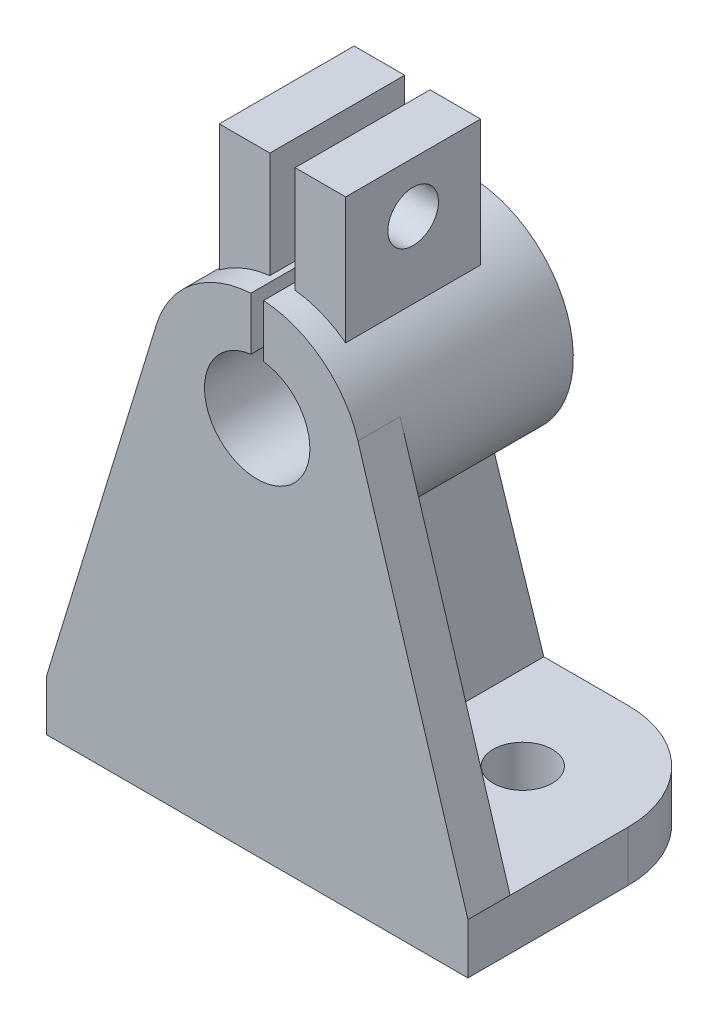
ISO-10303-21;
HEADER;
FILE_DESCRIPTION(('STEP AP214'),'2;1');
FILE_NAME('part.step','',(''),(''),'','','');
FILE_SCHEMA(('AUTOMOTIVE_DESIGN { 1 0 10303 214 1 1 1 1 }'));
ENDSEC;
DATA;
#1=APPLICATION_CONTEXT('core data for automotive mechanical design processes');
#2=APPLICATION_PROTOCOL_DEFINITION('international standard','automotive_design',2000,#1);
#3=PRODUCT_CONTEXT('',#1,'mechanical');
#4=PRODUCT('Part','Part','',(#3));
#5=PRODUCT_RELATED_PRODUCT_CATEGORY('part','',(#4));
#6=PRODUCT_DEFINITION_FORMATION('','',#4);
#7=PRODUCT_DEFINITION_CONTEXT('part definition',#1,'design');
#8=PRODUCT_DEFINITION('design','',#6,#7);
#9=PRODUCT_DEFINITION_SHAPE('','',#8);
#10=(LENGTH_UNIT() NAMED_UNIT(*) SI_UNIT(.MILLI.,.METRE.));
#11=(NAMED_UNIT(*) PLANE_ANGLE_UNIT() SI_UNIT($,.RADIAN.));
#12=(NAMED_UNIT(*) SI_UNIT($,.STERADIAN.) SOLID_ANGLE_UNIT());
#13=UNCERTAINTY_MEASURE_WITH_UNIT(LENGTH_MEASURE(1.E-05),#10,'distance_accuracy_value','');
#14=(GEOMETRIC_REPRESENTATION_CONTEXT(3) GLOBAL_UNCERTAINTY_ASSIGNED_CONTEXT((#13)) GLOBAL_UNIT_ASSIGNED_CONTEXT((#10,
#11,#12)) REPRESENTATION_CONTEXT('',''));
#15=CARTESIAN_POINT('',(0.,0.,0.));
#16=DIRECTION('',(0.,0.,1.));
#17=DIRECTION('',(1.,0.,0.));
#18=AXIS2_PLACEMENT_3D('',#15,#16,#17);
#19=CARTESIAN_POINT('',(0.,90.,-50.));
#20=DIRECTION('',(0.,0.,1.));
#21=DIRECTION('',(1.,0.,0.));
#22=AXIS2_PLACEMENT_3D('',#19,#20,#21);
#23=PLANE('',#22);
#24=CARTESIAN_POINT('',(0.,90.,-50.));
#25=DIRECTION('',(0.,0.,-1.));
#26=DIRECTION('',(-1.,0.,0.));
#27=AXIS2_PLACEMENT_3D('',#24,#25,#26);
#28=CIRCLE('',#27,12.5);
#29=CARTESIAN_POINT('',(1.5,102.409673645991,-50.));
#30=VERTEX_POINT('',#29);
#31=CARTESIAN_POINT('',(-1.5,102.409673645991,-50.));
#32=VERTEX_POINT('',#31);
#33=EDGE_CURVE('E217',#30,#32,#28,.T.);
#34=ORIENTED_EDGE('',*,*,#33,.F.);
#35=DIRECTION('',(0.,1.,0.));
#36=VECTOR('',#35,1.);
#37=CARTESIAN_POINT('',(1.5,90.,-50.));
#38=LINE('',#37,#36);
#39=CARTESIAN_POINT('',(1.5,114.954959426936,-50.));
#40=VERTEX_POINT('',#39);
#41=EDGE_CURVE('E230',#30,#40,#38,.T.);
#42=ORIENTED_EDGE('',*,*,#41,.T.);
#43=CARTESIAN_POINT('',(0.,90.,-50.));
#44=DIRECTION('',(0.,0.,1.));
#45=DIRECTION('',(1.,0.,0.));
#46=AXIS2_PLACEMENT_3D('',#43,#44,#45);
#47=CIRCLE('',#46,25.);
#48=CARTESIAN_POINT('',(0.,65.,-50.));
#49=VERTEX_POINT('',#48);
#50=EDGE_CURVE('E462',#49,#40,#47,.T.);
#51=ORIENTED_EDGE('',*,*,#50,.F.);
#52=CARTESIAN_POINT('',(-1.5,114.954959426936,-50.));
#53=VERTEX_POINT('',#52);
#54=EDGE_CURVE('E461',#53,#49,#47,.T.);
#55=ORIENTED_EDGE('',*,*,#54,.F.);
#56=DIRECTION('',(0.,1.,0.));
#57=VECTOR('',#56,1.);
#58=CARTESIAN_POINT('',(-1.50000000000001,140.,-50.));
#59=LINE('',#58,#57);
#60=EDGE_CURVE('E225',#32,#53,#59,.T.);
#61=ORIENTED_EDGE('',*,*,#60,.F.);
#62=EDGE_LOOP('',(#34,#42,#51,#55,#61));
#63=FACE_BOUND('',#62,.T.);
#64=ADVANCED_FACE('F45',(#63),#23,.F.);
#65=CARTESIAN_POINT('',(0.,90.,-10.));
#66=DIRECTION('',(0.,0.,1.));
#67=DIRECTION('',(1.,0.,0.));
#68=AXIS2_PLACEMENT_3D('',#65,#66,#67);
#69=CYLINDRICAL_SURFACE('',#68,25.);
#70=DIRECTION('',(0.,0.,1.));
#71=VECTOR('',#70,1.);
#72=CARTESIAN_POINT('',(1.5,114.954959426936,-10.));
#73=LINE('',#72,#71);
#74=CARTESIAN_POINT('',(1.5,114.954959426936,0.));
#75=VERTEX_POINT('',#74);
#76=EDGE_CURVE('E238',#75,#40,#73,.F.);
#77=ORIENTED_EDGE('',*,*,#76,.F.);
#78=CARTESIAN_POINT('',(0.,90.,0.));
#79=DIRECTION('',(0.,0.,1.));
#80=DIRECTION('',(1.,0.,0.));
#81=AXIS2_PLACEMENT_3D('',#78,#79,#80);
#82=CIRCLE('',#81,25.);
#83=CARTESIAN_POINT('',(23.9067793629531,97.3120380531751,0.));
#84=VERTEX_POINT('',#83);
#85=EDGE_CURVE('E471',#84,#75,#82,.T.);
#86=ORIENTED_EDGE('',*,*,#85,.F.);
#87=DIRECTION('',(0.,0.,1.));
#88=VECTOR('',#87,1.);
#89=CARTESIAN_POINT('',(23.9067793629531,97.3120380531751,-10.));
#90=LINE('',#89,#88);
#91=CARTESIAN_POINT('',(23.9067793629531,97.3120380531751,-10.));
#92=VERTEX_POINT('',#91);
#93=EDGE_CURVE('E494',#92,#84,#90,.T.);
#94=ORIENTED_EDGE('',*,*,#93,.F.);
#95=CARTESIAN_POINT('',(0.,90.,-10.));
#96=DIRECTION('',(0.,0.,1.));
#97=DIRECTION('',(1.,0.,0.));
#98=AXIS2_PLACEMENT_3D('',#95,#96,#97);
#99=CIRCLE('',#98,25.);
#100=CARTESIAN_POINT('',(5.,65.5051025721682,-10.));
#101=VERTEX_POINT('',#100);
#102=EDGE_CURVE('E327',#101,#92,#99,.T.);
#103=ORIENTED_EDGE('',*,*,#102,.F.);
#104=DIRECTION('',(0.,0.,1.));
#105=VECTOR('',#104,1.);
#106=CARTESIAN_POINT('',(5.,65.5051025721682,-10.));
#107=LINE('',#106,#105);
#108=CARTESIAN_POINT('',(5.,65.5051025721682,-49.8761069162606));
#109=VERTEX_POINT('',#108);
#110=EDGE_CURVE('E453',#109,#101,#107,.T.);
#111=ORIENTED_EDGE('',*,*,#110,.F.);
#112=CARTESIAN_POINT('',(0.,90.,-43.8679245283019));
#113=DIRECTION('',(0.,0.238221527797648,-0.971210844098105));
#114=DIRECTION('',(0.,0.971210844098105,0.238221527797648));
#115=AXIS2_PLACEMENT_3D('',#112,#113,#114);
#116=ELLIPSE('',#115,25.741063489891,25.);
#117=EDGE_CURVE('E434',#49,#109,#116,.F.);
#118=ORIENTED_EDGE('',*,*,#117,.F.);
#119=ORIENTED_EDGE('',*,*,#50,.T.);
#120=EDGE_LOOP('',(#77,#86,#94,#103,#111,#118,#119));
#121=FACE_BOUND('',#120,.T.);
#122=DIRECTION('',(0.,0.,1.));
#123=VECTOR('',#122,1.);
#124=CARTESIAN_POINT('',(15.,110.,-10.));
#125=LINE('',#124,#123);
#126=CARTESIAN_POINT('',(15.,110.,-6.00000000000001));
#127=VERTEX_POINT('',#126);
#128=CARTESIAN_POINT('',(15.,110.,-38.));
#129=VERTEX_POINT('',#128);
#130=EDGE_CURVE('E350',#127,#129,#125,.F.);
#131=ORIENTED_EDGE('',*,*,#130,.F.);
#132=CARTESIAN_POINT('',(0.,90.,-6.00000000000001));
#133=DIRECTION('',(0.,0.,-1.));
#134=DIRECTION('',(0.,1.,0.));
#135=AXIS2_PLACEMENT_3D('',#132,#133,#134);
#136=CIRCLE('',#135,25.);
#137=CARTESIAN_POINT('',(3.,114.819347291982,-6.));
#138=VERTEX_POINT('',#137);
#139=EDGE_CURVE('E346',#127,#138,#136,.F.);
#140=ORIENTED_EDGE('',*,*,#139,.T.);
#141=DIRECTION('',(0.,0.,1.));
#142=VECTOR('',#141,1.);
#143=CARTESIAN_POINT('',(3.,114.819347291982,-10.));
#144=LINE('',#143,#142);
#145=CARTESIAN_POINT('',(3.,114.819347291982,-38.));
#146=VERTEX_POINT('',#145);
#147=EDGE_CURVE('E338',#138,#146,#144,.F.);
#148=ORIENTED_EDGE('',*,*,#147,.T.);
#149=CARTESIAN_POINT('',(0.,90.,-38.));
#150=DIRECTION('',(0.,0.,1.));
#151=DIRECTION('',(0.,-1.,0.));
#152=AXIS2_PLACEMENT_3D('',#149,#150,#151);
#153=CIRCLE('',#152,25.);
#154=EDGE_CURVE('E342',#146,#129,#153,.F.);
#155=ORIENTED_EDGE('',*,*,#154,.T.);
#156=EDGE_LOOP('',(#131,#140,#148,#155));
#157=FACE_BOUND('',#156,.T.);
#158=ADVANCED_FACE('F520',(#121,#157),#69,.T.);
#159=CARTESIAN_POINT('',(0.,12.,0.));
#160=DIRECTION('',(0.,1.,0.));
#161=DIRECTION('',(0.,0.,1.));
#162=AXIS2_PLACEMENT_3D('',#159,#160,#161);
#163=PLANE('',#162);
#164=CARTESIAN_POINT('',(-25.,12.,-38.));
#165=DIRECTION('',(0.,1.,0.));
#166=DIRECTION('',(0.,0.,1.));
#167=AXIS2_PLACEMENT_3D('',#164,#165,#166);
#168=CIRCLE('',#167,7.00000000000001);
#169=CARTESIAN_POINT('',(-25.,12.,-31.));
#170=VERTEX_POINT('',#169);
#171=EDGE_CURVE('E906',#170,#170,#168,.T.);
#172=ORIENTED_EDGE('',*,*,#171,.F.);
#173=EDGE_LOOP('',(#172));
#174=FACE_BOUND('',#173,.T.);
#175=DIRECTION('',(-1.,0.,0.));
#176=VECTOR('',#175,1.);
#177=CARTESIAN_POINT('',(-50.,12.,-63.));
#178=LINE('',#177,#176);
#179=CARTESIAN_POINT('',(-5.,12.,-63.));
#180=VERTEX_POINT('',#179);
#181=CARTESIAN_POINT('',(-25.,12.,-63.));
#182=VERTEX_POINT('',#181);
#183=EDGE_CURVE('E286',#180,#182,#178,.T.);
#184=ORIENTED_EDGE('',*,*,#183,.T.);
#185=CARTESIAN_POINT('',(-25.,12.,-38.));
#186=DIRECTION('',(0.,1.,0.));
#187=DIRECTION('',(0.,0.,1.));
#188=AXIS2_PLACEMENT_3D('',#185,#186,#187);
#189=CIRCLE('',#188,25.);
#190=CARTESIAN_POINT('',(-50.,12.,-38.));
#191=VERTEX_POINT('',#190);
#192=EDGE_CURVE('E274',#182,#191,#189,.T.);
#193=ORIENTED_EDGE('',*,*,#192,.T.);
#194=DIRECTION('',(0.,0.,1.));
#195=VECTOR('',#194,1.);
#196=CARTESIAN_POINT('',(-50.,12.,-63.));
#197=LINE('',#196,#195);
#198=CARTESIAN_POINT('',(-50.,12.,-10.));
#199=VERTEX_POINT('',#198);
#200=EDGE_CURVE('E283',#191,#199,#197,.T.);
#201=ORIENTED_EDGE('',*,*,#200,.T.);
#202=DIRECTION('',(1.,0.,0.));
#203=VECTOR('',#202,1.);
#204=CARTESIAN_POINT('',(-50.,12.,-10.));
#205=LINE('',#204,#203);
#206=CARTESIAN_POINT('',(-5.,12.,-10.));
#207=VERTEX_POINT('',#206);
#208=EDGE_CURVE('E472',#199,#207,#205,.T.);
#209=ORIENTED_EDGE('',*,*,#208,.T.);
#210=DIRECTION('',(0.,0.,-1.));
#211=VECTOR('',#210,1.);
#212=CARTESIAN_POINT('',(-5.,12.,0.));
#213=LINE('',#212,#211);
#214=EDGE_CURVE('E450',#207,#180,#213,.T.);
#215=ORIENTED_EDGE('',*,*,#214,.T.);
#216=EDGE_LOOP('',(#184,#193,#201,#209,#215));
#217=FACE_BOUND('',#216,.T.);
#218=ADVANCED_FACE('F281',(#174,#217),#163,.T.);
#219=CARTESIAN_POINT('',(0.,90.,-10.));
#220=DIRECTION('',(0.,0.,1.));
#221=DIRECTION('',(1.,0.,0.));
#222=AXIS2_PLACEMENT_3D('',#219,#220,#221);
#223=PLANE('',#222);
#224=DIRECTION('',(0.,1.,0.));
#225=VECTOR('',#224,1.);
#226=CARTESIAN_POINT('',(-5.,90.,-10.));
#227=LINE('',#226,#225);
#228=CARTESIAN_POINT('',(-5.,65.5051025721682,-10.));
#229=VERTEX_POINT('',#228);
#230=EDGE_CURVE('E331',#207,#229,#227,.T.);
#231=ORIENTED_EDGE('',*,*,#230,.F.);
#232=ORIENTED_EDGE('',*,*,#208,.F.);
#233=DIRECTION('',(-0.292481522127003,-0.956271174518124,0.));
#234=VECTOR('',#233,1.);
#235=CARTESIAN_POINT('',(-50.,12.,-10.));
#236=LINE('',#235,#234);
#237=CARTESIAN_POINT('',(-23.9067793629531,97.312038053175,-10.));
#238=VERTEX_POINT('',#237);
#239=EDGE_CURVE('E466',#238,#199,#236,.T.);
#240=ORIENTED_EDGE('',*,*,#239,.F.);
#241=EDGE_CURVE('E328',#238,#229,#99,.T.);
#242=ORIENTED_EDGE('',*,*,#241,.T.);
#243=EDGE_LOOP('',(#231,#232,#240,#242));
#244=FACE_BOUND('',#243,.T.);
#245=ADVANCED_FACE('F537',(#244),#223,.F.);
#246=CARTESIAN_POINT('',(25.,12.,-38.));
#247=DIRECTION('',(0.,1.,0.));
#248=DIRECTION('',(0.,0.,1.));
#249=AXIS2_PLACEMENT_3D('',#246,#247,#248);
#250=CIRCLE('',#249,7.00000000000001);
#251=CARTESIAN_POINT('',(25.,12.,-31.));
#252=VERTEX_POINT('',#251);
#253=EDGE_CURVE('E898',#252,#252,#250,.T.);
#254=ORIENTED_EDGE('',*,*,#253,.F.);
#255=EDGE_LOOP('',(#254));
#256=FACE_BOUND('',#255,.T.);
#257=DIRECTION('',(0.,0.,-1.));
#258=VECTOR('',#257,1.);
#259=CARTESIAN_POINT('',(50.,12.,-63.));
#260=LINE('',#259,#258);
#261=CARTESIAN_POINT('',(50.,12.,-10.));
#262=VERTEX_POINT('',#261);
#263=CARTESIAN_POINT('',(50.,12.,-38.));
#264=VERTEX_POINT('',#263);
#265=EDGE_CURVE('E297',#262,#264,#260,.T.);
#266=ORIENTED_EDGE('',*,*,#265,.T.);
#267=CARTESIAN_POINT('',(25.,12.,-38.));
#268=DIRECTION('',(0.,1.,0.));
#269=DIRECTION('',(0.,0.,1.));
#270=AXIS2_PLACEMENT_3D('',#267,#268,#269);
#271=CIRCLE('',#270,25.);
#272=CARTESIAN_POINT('',(25.,12.,-63.));
#273=VERTEX_POINT('',#272);
#274=EDGE_CURVE('E11',#264,#273,#271,.T.);
#275=ORIENTED_EDGE('',*,*,#274,.T.);
#276=CARTESIAN_POINT('',(5.,12.,-63.));
#277=VERTEX_POINT('',#276);
#278=EDGE_CURVE('E323',#273,#277,#178,.T.);
#279=ORIENTED_EDGE('',*,*,#278,.T.);
#280=DIRECTION('',(0.,0.,-1.));
#281=VECTOR('',#280,1.);
#282=CARTESIAN_POINT('',(5.,12.,0.));
#283=LINE('',#282,#281);
#284=CARTESIAN_POINT('',(5.,12.,-10.));
#285=VERTEX_POINT('',#284);
#286=EDGE_CURVE('E457',#285,#277,#283,.T.);
#287=ORIENTED_EDGE('',*,*,#286,.F.);
#288=EDGE_CURVE('E470',#285,#262,#205,.T.);
#289=ORIENTED_EDGE('',*,*,#288,.T.);
#290=EDGE_LOOP('',(#266,#275,#279,#287,#289));
#291=FACE_BOUND('',#290,.T.);
#292=ADVANCED_FACE('F547',(#256,#291),#163,.T.);
#293=CARTESIAN_POINT('',(-50.,12.,-63.));
#294=DIRECTION('',(1.,0.,0.));
#295=DIRECTION('',(0.,0.,-1.));
#296=AXIS2_PLACEMENT_3D('',#293,#294,#295);
#297=PLANE('',#296);
#298=ORIENTED_EDGE('',*,*,#200,.F.);
#299=DIRECTION('',(0.,-1.,0.));
#300=VECTOR('',#299,1.);
#301=CARTESIAN_POINT('',(-50.,12.,-38.));
#302=LINE('',#301,#300);
#303=CARTESIAN_POINT('',(-50.,0.,-38.));
#304=VERTEX_POINT('',#303);
#305=EDGE_CURVE('E246',#191,#304,#302,.T.);
#306=ORIENTED_EDGE('',*,*,#305,.T.);
#307=DIRECTION('',(0.,0.,1.));
#308=VECTOR('',#307,1.);
#309=CARTESIAN_POINT('',(-50.,0.,-63.));
#310=LINE('',#309,#308);
#311=CARTESIAN_POINT('',(-50.,0.,0.));
#312=VERTEX_POINT('',#311);
#313=EDGE_CURVE('E306',#304,#312,#310,.T.);
#314=ORIENTED_EDGE('',*,*,#313,.T.);
#315=DIRECTION('',(0.,-1.,0.));
#316=VECTOR('',#315,1.);
#317=CARTESIAN_POINT('',(-50.,12.,0.));
#318=LINE('',#317,#316);
#319=CARTESIAN_POINT('',(-50.,12.,0.));
#320=VERTEX_POINT('',#319);
#321=EDGE_CURVE('E322',#320,#312,#318,.T.);
#322=ORIENTED_EDGE('',*,*,#321,.F.);
#323=DIRECTION('',(0.,0.,1.));
#324=VECTOR('',#323,1.);
#325=CARTESIAN_POINT('',(-50.,12.,-10.));
#326=LINE('',#325,#324);
#327=EDGE_CURVE('E295',#199,#320,#326,.T.);
#328=ORIENTED_EDGE('',*,*,#327,.F.);
#329=EDGE_LOOP('',(#298,#306,#314,#322,#328));
#330=FACE_BOUND('',#329,.T.);
#331=ADVANCED_FACE('F292',(#330),#297,.F.);
#332=CARTESIAN_POINT('',(-50.,12.,0.));
#333=DIRECTION('',(0.,0.,-1.));
#334=DIRECTION('',(-1.,0.,0.));
#335=AXIS2_PLACEMENT_3D('',#332,#333,#334);
#336=PLANE('',#335);
#337=DIRECTION('',(0.,-1.,0.));
#338=VECTOR('',#337,1.);
#339=CARTESIAN_POINT('',(1.50000000000001,140.,0.));
#340=LINE('',#339,#338);
#341=CARTESIAN_POINT('',(1.5,102.409673645991,0.));
#342=VERTEX_POINT('',#341);
#343=EDGE_CURVE('E878',#75,#342,#340,.T.);
#344=ORIENTED_EDGE('',*,*,#343,.T.);
#345=CARTESIAN_POINT('',(0.,90.,0.));
#346=DIRECTION('',(0.,0.,-1.));
#347=DIRECTION('',(-1.,0.,0.));
#348=AXIS2_PLACEMENT_3D('',#345,#346,#347);
#349=CIRCLE('',#348,12.5);
#350=CARTESIAN_POINT('',(-1.5,102.409673645991,0.));
#351=VERTEX_POINT('',#350);
#352=EDGE_CURVE('E220',#342,#351,#349,.T.);
#353=ORIENTED_EDGE('',*,*,#352,.T.);
#354=DIRECTION('',(0.,1.,0.));
#355=VECTOR('',#354,1.);
#356=CARTESIAN_POINT('',(-1.50000000000001,140.,0.));
#357=LINE('',#356,#355);
#358=CARTESIAN_POINT('',(-1.5,114.954959426936,0.));
#359=VERTEX_POINT('',#358);
#360=EDGE_CURVE('E873',#351,#359,#357,.T.);
#361=ORIENTED_EDGE('',*,*,#360,.T.);
#362=CARTESIAN_POINT('',(-23.9067793629531,97.312038053175,0.));
#363=VERTEX_POINT('',#362);
#364=EDGE_CURVE('E486',#359,#363,#82,.T.);
#365=ORIENTED_EDGE('',*,*,#364,.T.);
#366=DIRECTION('',(-0.292481522127003,-0.956271174518124,0.));
#367=VECTOR('',#366,1.);
#368=CARTESIAN_POINT('',(-50.,12.,0.));
#369=LINE('',#368,#367);
#370=EDGE_CURVE('E465',#363,#320,#369,.T.);
#371=ORIENTED_EDGE('',*,*,#370,.T.);
#372=ORIENTED_EDGE('',*,*,#321,.T.);
#373=DIRECTION('',(1.,0.,0.));
#374=VECTOR('',#373,1.);
#375=CARTESIAN_POINT('',(-50.,0.,0.));
#376=LINE('',#375,#374);
#377=CARTESIAN_POINT('',(50.,0.,0.));
#378=VERTEX_POINT('',#377);
#379=EDGE_CURVE('E314',#312,#378,#376,.T.);
#380=ORIENTED_EDGE('',*,*,#379,.T.);
#381=DIRECTION('',(0.,-1.,0.));
#382=VECTOR('',#381,1.);
#383=CARTESIAN_POINT('',(50.,12.,0.));
#384=LINE('',#383,#382);
#385=CARTESIAN_POINT('',(50.,12.,0.));
#386=VERTEX_POINT('',#385);
#387=EDGE_CURVE('E318',#386,#378,#384,.T.);
#388=ORIENTED_EDGE('',*,*,#387,.F.);
#389=DIRECTION('',(-0.292481522127002,0.956271174518124,0.));
#390=VECTOR('',#389,1.);
#391=CARTESIAN_POINT('',(50.,12.,0.));
#392=LINE('',#391,#390);
#393=EDGE_CURVE('E482',#386,#84,#392,.T.);
#394=ORIENTED_EDGE('',*,*,#393,.T.);
#395=ORIENTED_EDGE('',*,*,#85,.T.);
#396=EDGE_LOOP('',(#344,#353,#361,#365,#371,#372,#380,#388,#394,#395));
#397=FACE_BOUND('',#396,.T.);
#398=ADVANCED_FACE('F509',(#397),#336,.F.);
#399=CARTESIAN_POINT('',(50.,12.,-63.));
#400=DIRECTION('',(-1.,0.,0.));
#401=DIRECTION('',(0.,0.,1.));
#402=AXIS2_PLACEMENT_3D('',#399,#400,#401);
#403=PLANE('',#402);
#404=DIRECTION('',(0.,0.,-1.));
#405=VECTOR('',#404,1.);
#406=CARTESIAN_POINT('',(50.,0.,-63.));
#407=LINE('',#406,#405);
#408=CARTESIAN_POINT('',(50.,0.,-38.));
#409=VERTEX_POINT('',#408);
#410=EDGE_CURVE('E311',#378,#409,#407,.T.);
#411=ORIENTED_EDGE('',*,*,#410,.T.);
#412=DIRECTION('',(0.,-1.,0.));
#413=VECTOR('',#412,1.);
#414=CARTESIAN_POINT('',(50.,12.,-38.));
#415=LINE('',#414,#413);
#416=EDGE_CURVE('E54',#409,#264,#415,.F.);
#417=ORIENTED_EDGE('',*,*,#416,.T.);
#418=ORIENTED_EDGE('',*,*,#265,.F.);
#419=EDGE_CURVE('E499',#386,#262,#260,.T.);
#420=ORIENTED_EDGE('',*,*,#419,.F.);
#421=ORIENTED_EDGE('',*,*,#387,.T.);
#422=EDGE_LOOP('',(#411,#417,#418,#420,#421));
#423=FACE_BOUND('',#422,.T.);
#424=ADVANCED_FACE('F512',(#423),#403,.F.);
#425=CARTESIAN_POINT('',(-50.,12.,-63.));
#426=DIRECTION('',(0.,0.,1.));
#427=DIRECTION('',(1.,0.,0.));
#428=AXIS2_PLACEMENT_3D('',#425,#426,#427);
#429=PLANE('',#428);
#430=DIRECTION('',(-1.,0.,0.));
#431=VECTOR('',#430,1.);
#432=CARTESIAN_POINT('',(-50.,0.,-63.));
#433=LINE('',#432,#431);
#434=CARTESIAN_POINT('',(25.,0.,-63.));
#435=VERTEX_POINT('',#434);
#436=CARTESIAN_POINT('',(-25.,0.,-63.));
#437=VERTEX_POINT('',#436);
#438=EDGE_CURVE('E298',#435,#437,#433,.T.);
#439=ORIENTED_EDGE('',*,*,#438,.T.);
#440=DIRECTION('',(0.,-1.,0.));
#441=VECTOR('',#440,1.);
#442=CARTESIAN_POINT('',(-25.,12.,-63.));
#443=LINE('',#442,#441);
#444=EDGE_CURVE('E271',#437,#182,#443,.F.);
#445=ORIENTED_EDGE('',*,*,#444,.T.);
#446=ORIENTED_EDGE('',*,*,#183,.F.);
#447=DIRECTION('',(-1.,0.,0.));
#448=VECTOR('',#447,1.);
#449=CARTESIAN_POINT('',(-50.,12.0000000000001,-63.));
#450=LINE('',#449,#448);
#451=EDGE_CURVE('E442',#277,#180,#450,.T.);
#452=ORIENTED_EDGE('',*,*,#451,.F.);
#453=ORIENTED_EDGE('',*,*,#278,.F.);
#454=DIRECTION('',(0.,-1.,0.));
#455=VECTOR('',#454,1.);
#456=CARTESIAN_POINT('',(25.,12.,-63.));
#457=LINE('',#456,#455);
#458=EDGE_CURVE('E267',#273,#435,#457,.T.);
#459=ORIENTED_EDGE('',*,*,#458,.T.);
#460=EDGE_LOOP('',(#439,#445,#446,#452,#453,#459));
#461=FACE_BOUND('',#460,.T.);
#462=ADVANCED_FACE('F308',(#461),#429,.F.);
#463=CARTESIAN_POINT('',(0.,0.,0.));
#464=DIRECTION('',(0.,1.,0.));
#465=DIRECTION('',(0.,0.,1.));
#466=AXIS2_PLACEMENT_3D('',#463,#464,#465);
#467=PLANE('',#466);
#468=CARTESIAN_POINT('',(-25.,0.,-38.));
#469=DIRECTION('',(0.,1.,0.));
#470=DIRECTION('',(0.,0.,1.));
#471=AXIS2_PLACEMENT_3D('',#468,#469,#470);
#472=CIRCLE('',#471,7.00000000000001);
#473=CARTESIAN_POINT('',(-25.,0.,-31.));
#474=VERTEX_POINT('',#473);
#475=EDGE_CURVE('E902',#474,#474,#472,.T.);
#476=ORIENTED_EDGE('',*,*,#475,.T.);
#477=EDGE_LOOP('',(#476));
#478=FACE_BOUND('',#477,.T.);
#479=CARTESIAN_POINT('',(25.,0.,-38.));
#480=DIRECTION('',(0.,1.,0.));
#481=DIRECTION('',(0.,0.,1.));
#482=AXIS2_PLACEMENT_3D('',#479,#480,#481);
#483=CIRCLE('',#482,7.00000000000001);
#484=CARTESIAN_POINT('',(25.,0.,-31.));
#485=VERTEX_POINT('',#484);
#486=EDGE_CURVE('E894',#485,#485,#483,.T.);
#487=ORIENTED_EDGE('',*,*,#486,.T.);
#488=EDGE_LOOP('',(#487));
#489=FACE_BOUND('',#488,.T.);
#490=ORIENTED_EDGE('',*,*,#313,.F.);
#491=CARTESIAN_POINT('',(-25.,0.,-38.));
#492=DIRECTION('',(0.,1.,0.));
#493=DIRECTION('',(0.,0.,1.));
#494=AXIS2_PLACEMENT_3D('',#491,#492,#493);
#495=CIRCLE('',#494,25.);
#496=EDGE_CURVE('E264',#304,#437,#495,.F.);
#497=ORIENTED_EDGE('',*,*,#496,.T.);
#498=ORIENTED_EDGE('',*,*,#438,.F.);
#499=CARTESIAN_POINT('',(25.,0.,-38.));
#500=DIRECTION('',(0.,1.,0.));
#501=DIRECTION('',(0.,0.,1.));
#502=AXIS2_PLACEMENT_3D('',#499,#500,#501);
#503=CIRCLE('',#502,25.);
#504=EDGE_CURVE('E261',#435,#409,#503,.F.);
#505=ORIENTED_EDGE('',*,*,#504,.T.);
#506=ORIENTED_EDGE('',*,*,#410,.F.);
#507=ORIENTED_EDGE('',*,*,#379,.F.);
#508=EDGE_LOOP('',(#490,#497,#498,#505,#506,#507));
#509=FACE_BOUND('',#508,.T.);
#510=ADVANCED_FACE('F304',(#478,#489,#509),#467,.F.);
#511=CARTESIAN_POINT('',(-50.,12.,-10.));
#512=DIRECTION('',(-0.956271174518124,0.292481522127003,0.));
#513=DIRECTION('',(-0.292481522127003,-0.956271174518124,0.));
#514=AXIS2_PLACEMENT_3D('',#511,#512,#513);
#515=PLANE('',#514);
#516=ORIENTED_EDGE('',*,*,#370,.F.);
#517=DIRECTION('',(0.,0.,1.));
#518=VECTOR('',#517,1.);
#519=CARTESIAN_POINT('',(-23.9067793629531,97.312038053175,-10.));
#520=LINE('',#519,#518);
#521=EDGE_CURVE('E490',#238,#363,#520,.T.);
#522=ORIENTED_EDGE('',*,*,#521,.F.);
#523=ORIENTED_EDGE('',*,*,#239,.T.);
#524=ORIENTED_EDGE('',*,*,#327,.T.);
#525=EDGE_LOOP('',(#516,#522,#523,#524));
#526=FACE_BOUND('',#525,.T.);
#527=ADVANCED_FACE('F539',(#526),#515,.T.);
#528=DIRECTION('',(0.,0.,1.));
#529=VECTOR('',#528,1.);
#530=CARTESIAN_POINT('',(-1.5,114.954959426936,-10.));
#531=LINE('',#530,#529);
#532=EDGE_CURVE('E870',#53,#359,#531,.T.);
#533=ORIENTED_EDGE('',*,*,#532,.F.);
#534=ORIENTED_EDGE('',*,*,#54,.T.);
#535=CARTESIAN_POINT('',(-5.,65.5051025721682,-49.8761069162606));
#536=VERTEX_POINT('',#535);
#537=EDGE_CURVE('E438',#536,#49,#116,.F.);
#538=ORIENTED_EDGE('',*,*,#537,.F.);
#539=DIRECTION('',(0.,0.,1.));
#540=VECTOR('',#539,1.);
#541=CARTESIAN_POINT('',(-5.,65.5051025721682,-10.));
#542=LINE('',#541,#540);
#543=EDGE_CURVE('E446',#536,#229,#542,.T.);
#544=ORIENTED_EDGE('',*,*,#543,.T.);
#545=ORIENTED_EDGE('',*,*,#241,.F.);
#546=ORIENTED_EDGE('',*,*,#521,.T.);
#547=ORIENTED_EDGE('',*,*,#364,.F.);
#548=EDGE_LOOP('',(#533,#534,#538,#544,#545,#546,#547));
#549=FACE_BOUND('',#548,.T.);
#550=DIRECTION('',(0.,0.,1.));
#551=VECTOR('',#550,1.);
#552=CARTESIAN_POINT('',(-15.,110.,-10.));
#553=LINE('',#552,#551);
#554=CARTESIAN_POINT('',(-15.,110.,-38.));
#555=VERTEX_POINT('',#554);
#556=CARTESIAN_POINT('',(-15.,110.,-6.00000000000001));
#557=VERTEX_POINT('',#556);
#558=EDGE_CURVE('E242',#555,#557,#553,.T.);
#559=ORIENTED_EDGE('',*,*,#558,.F.);
#560=CARTESIAN_POINT('',(0.,90.,-38.));
#561=DIRECTION('',(0.,0.,-1.));
#562=DIRECTION('',(0.,1.,0.));
#563=AXIS2_PLACEMENT_3D('',#560,#561,#562);
#564=CIRCLE('',#563,25.);
#565=CARTESIAN_POINT('',(-3.,114.819347291982,-38.));
#566=VERTEX_POINT('',#565);
#567=EDGE_CURVE('E357',#566,#555,#564,.F.);
#568=ORIENTED_EDGE('',*,*,#567,.F.);
#569=DIRECTION('',(0.,0.,1.));
#570=VECTOR('',#569,1.);
#571=CARTESIAN_POINT('',(-3.,114.819347291982,-10.));
#572=LINE('',#571,#570);
#573=CARTESIAN_POINT('',(-3.,114.819347291982,-6.));
#574=VERTEX_POINT('',#573);
#575=EDGE_CURVE('E353',#566,#574,#572,.T.);
#576=ORIENTED_EDGE('',*,*,#575,.T.);
#577=CARTESIAN_POINT('',(0.,90.,-6.00000000000001));
#578=DIRECTION('',(0.,0.,1.));
#579=DIRECTION('',(0.,-1.,0.));
#580=AXIS2_PLACEMENT_3D('',#577,#578,#579);
#581=CIRCLE('',#580,25.);
#582=EDGE_CURVE('E248',#557,#574,#581,.F.);
#583=ORIENTED_EDGE('',*,*,#582,.F.);
#584=EDGE_LOOP('',(#559,#568,#576,#583));
#585=FACE_BOUND('',#584,.T.);
#586=ADVANCED_FACE('F373',(#549,#585),#69,.T.);
#587=CARTESIAN_POINT('',(50.,12.,-10.));
#588=DIRECTION('',(0.956271174518124,0.292481522127002,0.));
#589=DIRECTION('',(-0.292481522127002,0.956271174518124,0.));
#590=AXIS2_PLACEMENT_3D('',#587,#588,#589);
#591=PLANE('',#590);
#592=ORIENTED_EDGE('',*,*,#393,.F.);
#593=ORIENTED_EDGE('',*,*,#419,.T.);
#594=DIRECTION('',(-0.292481522127002,0.956271174518124,0.));
#595=VECTOR('',#594,1.);
#596=CARTESIAN_POINT('',(50.,12.,-10.));
#597=LINE('',#596,#595);
#598=EDGE_CURVE('E475',#262,#92,#597,.T.);
#599=ORIENTED_EDGE('',*,*,#598,.T.);
#600=ORIENTED_EDGE('',*,*,#93,.T.);
#601=EDGE_LOOP('',(#592,#593,#599,#600));
#602=FACE_BOUND('',#601,.T.);
#603=ADVANCED_FACE('F535',(#602),#591,.T.);
#604=ORIENTED_EDGE('',*,*,#288,.F.);
#605=DIRECTION('',(0.,1.,0.));
#606=VECTOR('',#605,1.);
#607=CARTESIAN_POINT('',(5.,90.,-10.));
#608=LINE('',#607,#606);
#609=EDGE_CURVE('E335',#285,#101,#608,.T.);
#610=ORIENTED_EDGE('',*,*,#609,.T.);
#611=ORIENTED_EDGE('',*,*,#102,.T.);
#612=ORIENTED_EDGE('',*,*,#598,.F.);
#613=EDGE_LOOP('',(#604,#610,#611,#612));
#614=FACE_BOUND('',#613,.T.);
#615=ADVANCED_FACE('F533',(#614),#223,.F.);
#616=CARTESIAN_POINT('',(0.,12.,-63.));
#617=DIRECTION('',(0.,0.238221527797648,-0.971210844098105));
#618=DIRECTION('',(0.,0.971210844098105,0.238221527797648));
#619=AXIS2_PLACEMENT_3D('',#616,#617,#618);
#620=PLANE('',#619);
#621=DIRECTION('',(0.,0.971210844098105,0.238221527797648));
#622=VECTOR('',#621,1.);
#623=CARTESIAN_POINT('',(5.,12.,-63.));
#624=LINE('',#623,#622);
#625=EDGE_CURVE('E430',#277,#109,#624,.T.);
#626=ORIENTED_EDGE('',*,*,#625,.F.);
#627=ORIENTED_EDGE('',*,*,#451,.T.);
#628=DIRECTION('',(0.,0.971210844098105,0.238221527797648));
#629=VECTOR('',#628,1.);
#630=CARTESIAN_POINT('',(-5.,12.,-63.));
#631=LINE('',#630,#629);
#632=EDGE_CURVE('E429',#180,#536,#631,.T.);
#633=ORIENTED_EDGE('',*,*,#632,.T.);
#634=ORIENTED_EDGE('',*,*,#537,.T.);
#635=ORIENTED_EDGE('',*,*,#117,.T.);
#636=EDGE_LOOP('',(#626,#627,#633,#634,#635));
#637=FACE_BOUND('',#636,.T.);
#638=ADVANCED_FACE('F531',(#637),#620,.T.);
#639=CARTESIAN_POINT('',(5.,57.5,-31.5));
#640=DIRECTION('',(1.,0.,0.));
#641=DIRECTION('',(0.,0.,-1.));
#642=AXIS2_PLACEMENT_3D('',#639,#640,#641);
#643=PLANE('',#642);
#644=ORIENTED_EDGE('',*,*,#609,.F.);
#645=ORIENTED_EDGE('',*,*,#286,.T.);
#646=ORIENTED_EDGE('',*,*,#625,.T.);
#647=ORIENTED_EDGE('',*,*,#110,.T.);
#648=EDGE_LOOP('',(#644,#645,#646,#647));
#649=FACE_BOUND('',#648,.T.);
#650=ADVANCED_FACE('F763',(#649),#643,.T.);
#651=CARTESIAN_POINT('',(-5.,57.5,-31.5));
#652=DIRECTION('',(1.,0.,0.));
#653=DIRECTION('',(0.,0.,-1.));
#654=AXIS2_PLACEMENT_3D('',#651,#652,#653);
#655=PLANE('',#654);
#656=ORIENTED_EDGE('',*,*,#214,.F.);
#657=ORIENTED_EDGE('',*,*,#230,.T.);
#658=ORIENTED_EDGE('',*,*,#543,.F.);
#659=ORIENTED_EDGE('',*,*,#632,.F.);
#660=EDGE_LOOP('',(#656,#657,#658,#659));
#661=FACE_BOUND('',#660,.T.);
#662=ADVANCED_FACE('F754',(#661),#655,.F.);
#663=CARTESIAN_POINT('',(15.,140.,-6.));
#664=DIRECTION('',(0.,0.,-1.));
#665=DIRECTION('',(0.,1.,0.));
#666=AXIS2_PLACEMENT_3D('',#663,#664,#665);
#667=PLANE('',#666);
#668=ORIENTED_EDGE('',*,*,#139,.F.);
#669=DIRECTION('',(0.,-1.,0.));
#670=VECTOR('',#669,1.);
#671=CARTESIAN_POINT('',(15.,140.,-6.));
#672=LINE('',#671,#670);
#673=CARTESIAN_POINT('',(15.,140.,-6.));
#674=VERTEX_POINT('',#673);
#675=EDGE_CURVE('E402',#674,#127,#672,.T.);
#676=ORIENTED_EDGE('',*,*,#675,.F.);
#677=DIRECTION('',(-1.,0.,0.));
#678=VECTOR('',#677,1.);
#679=CARTESIAN_POINT('',(15.,140.,-6.));
#680=LINE('',#679,#678);
#681=CARTESIAN_POINT('',(3.,140.,-6.));
#682=VERTEX_POINT('',#681);
#683=EDGE_CURVE('E413',#674,#682,#680,.T.);
#684=ORIENTED_EDGE('',*,*,#683,.T.);
#685=DIRECTION('',(0.,-1.,0.));
#686=VECTOR('',#685,1.);
#687=CARTESIAN_POINT('',(3.,140.,-6.));
#688=LINE('',#687,#686);
#689=EDGE_CURVE('E401',#682,#138,#688,.T.);
#690=ORIENTED_EDGE('',*,*,#689,.T.);
#691=EDGE_LOOP('',(#668,#676,#684,#690));
#692=FACE_BOUND('',#691,.T.);
#693=ADVANCED_FACE('F745',(#692),#667,.F.);
#694=CARTESIAN_POINT('',(15.,140.,-38.));
#695=DIRECTION('',(0.,0.,1.));
#696=DIRECTION('',(0.,-1.,0.));
#697=AXIS2_PLACEMENT_3D('',#694,#695,#696);
#698=PLANE('',#697);
#699=ORIENTED_EDGE('',*,*,#154,.F.);
#700=DIRECTION('',(0.,1.,0.));
#701=VECTOR('',#700,1.);
#702=CARTESIAN_POINT('',(3.,140.,-38.));
#703=LINE('',#702,#701);
#704=CARTESIAN_POINT('',(3.,140.,-38.));
#705=VERTEX_POINT('',#704);
#706=EDGE_CURVE('E417',#146,#705,#703,.T.);
#707=ORIENTED_EDGE('',*,*,#706,.T.);
#708=DIRECTION('',(-1.,0.,0.));
#709=VECTOR('',#708,1.);
#710=CARTESIAN_POINT('',(15.,140.,-38.));
#711=LINE('',#710,#709);
#712=CARTESIAN_POINT('',(15.,140.,-38.));
#713=VERTEX_POINT('',#712);
#714=EDGE_CURVE('E425',#713,#705,#711,.T.);
#715=ORIENTED_EDGE('',*,*,#714,.F.);
#716=DIRECTION('',(0.,1.,0.));
#717=VECTOR('',#716,1.);
#718=CARTESIAN_POINT('',(15.,140.,-38.));
#719=LINE('',#718,#717);
#720=EDGE_CURVE('E406',#129,#713,#719,.T.);
#721=ORIENTED_EDGE('',*,*,#720,.F.);
#722=EDGE_LOOP('',(#699,#707,#715,#721));
#723=FACE_BOUND('',#722,.T.);
#724=ADVANCED_FACE('F736',(#723),#698,.F.);
#725=CARTESIAN_POINT('',(15.,140.,-6.));
#726=DIRECTION('',(0.,-1.,0.));
#727=DIRECTION('',(0.,0.,-1.));
#728=AXIS2_PLACEMENT_3D('',#725,#726,#727);
#729=PLANE('',#728);
#730=DIRECTION('',(0.,0.,1.));
#731=VECTOR('',#730,1.);
#732=CARTESIAN_POINT('',(3.,140.,-6.));
#733=LINE('',#732,#731);
#734=EDGE_CURVE('E407',#705,#682,#733,.T.);
#735=ORIENTED_EDGE('',*,*,#734,.T.);
#736=ORIENTED_EDGE('',*,*,#683,.F.);
#737=DIRECTION('',(0.,0.,1.));
#738=VECTOR('',#737,1.);
#739=CARTESIAN_POINT('',(15.,140.,-6.));
#740=LINE('',#739,#738);
#741=EDGE_CURVE('E410',#713,#674,#740,.T.);
#742=ORIENTED_EDGE('',*,*,#741,.F.);
#743=ORIENTED_EDGE('',*,*,#714,.T.);
#744=EDGE_LOOP('',(#735,#736,#742,#743));
#745=FACE_BOUND('',#744,.T.);
#746=ADVANCED_FACE('F727',(#745),#729,.F.);
#747=CARTESIAN_POINT('',(15.,0.,0.));
#748=DIRECTION('',(1.,0.,0.));
#749=DIRECTION('',(0.,0.,-1.));
#750=AXIS2_PLACEMENT_3D('',#747,#748,#749);
#751=PLANE('',#750);
#752=CARTESIAN_POINT('',(15.,128.,-22.));
#753=DIRECTION('',(1.,0.,0.));
#754=DIRECTION('',(0.,0.,-1.));
#755=AXIS2_PLACEMENT_3D('',#752,#753,#754);
#756=CIRCLE('',#755,6.00000000000001);
#757=CARTESIAN_POINT('',(15.,128.,-28.));
#758=VERTEX_POINT('',#757);
#759=EDGE_CURVE('E234',#758,#758,#756,.T.);
#760=ORIENTED_EDGE('',*,*,#759,.F.);
#761=EDGE_LOOP('',(#760));
#762=FACE_BOUND('',#761,.T.);
#763=ORIENTED_EDGE('',*,*,#675,.T.);
#764=ORIENTED_EDGE('',*,*,#130,.T.);
#765=ORIENTED_EDGE('',*,*,#720,.T.);
#766=ORIENTED_EDGE('',*,*,#741,.T.);
#767=EDGE_LOOP('',(#763,#764,#765,#766));
#768=FACE_BOUND('',#767,.T.);
#769=ADVANCED_FACE('F719',(#762,#768),#751,.T.);
#770=CARTESIAN_POINT('',(3.,0.,0.));
#771=DIRECTION('',(1.,0.,0.));
#772=DIRECTION('',(0.,0.,-1.));
#773=AXIS2_PLACEMENT_3D('',#770,#771,#772);
#774=PLANE('',#773);
#775=CARTESIAN_POINT('',(3.,128.,-22.));
#776=DIRECTION('',(1.,0.,0.));
#777=DIRECTION('',(0.,0.,-1.));
#778=AXIS2_PLACEMENT_3D('',#775,#776,#777);
#779=CIRCLE('',#778,6.00000000000001);
#780=CARTESIAN_POINT('',(3.,128.,-28.));
#781=VERTEX_POINT('',#780);
#782=EDGE_CURVE('E256',#781,#781,#779,.T.);
#783=ORIENTED_EDGE('',*,*,#782,.T.);
#784=EDGE_LOOP('',(#783));
#785=FACE_BOUND('',#784,.T.);
#786=ORIENTED_EDGE('',*,*,#147,.F.);
#787=ORIENTED_EDGE('',*,*,#689,.F.);
#788=ORIENTED_EDGE('',*,*,#734,.F.);
#789=ORIENTED_EDGE('',*,*,#706,.F.);
#790=EDGE_LOOP('',(#786,#787,#788,#789));
#791=FACE_BOUND('',#790,.T.);
#792=ADVANCED_FACE('F711',(#785,#791),#774,.F.);
#793=CARTESIAN_POINT('',(-15.,140.,-6.));
#794=DIRECTION('',(0.,0.,1.));
#795=DIRECTION('',(0.,-1.,0.));
#796=AXIS2_PLACEMENT_3D('',#793,#794,#795);
#797=PLANE('',#796);
#798=DIRECTION('',(0.,-1.,0.));
#799=VECTOR('',#798,1.);
#800=CARTESIAN_POINT('',(-15.,140.,-6.));
#801=LINE('',#800,#799);
#802=CARTESIAN_POINT('',(-15.,140.,-6.));
#803=VERTEX_POINT('',#802);
#804=EDGE_CURVE('E369',#803,#557,#801,.T.);
#805=ORIENTED_EDGE('',*,*,#804,.T.);
#806=ORIENTED_EDGE('',*,*,#582,.T.);
#807=DIRECTION('',(0.,-1.,0.));
#808=VECTOR('',#807,1.);
#809=CARTESIAN_POINT('',(-3.,140.,-6.));
#810=LINE('',#809,#808);
#811=CARTESIAN_POINT('',(-3.,140.,-6.));
#812=VERTEX_POINT('',#811);
#813=EDGE_CURVE('E366',#812,#574,#810,.T.);
#814=ORIENTED_EDGE('',*,*,#813,.F.);
#815=DIRECTION('',(1.,0.,0.));
#816=VECTOR('',#815,1.);
#817=CARTESIAN_POINT('',(-15.,140.,-6.));
#818=LINE('',#817,#816);
#819=EDGE_CURVE('E397',#803,#812,#818,.T.);
#820=ORIENTED_EDGE('',*,*,#819,.F.);
#821=EDGE_LOOP('',(#805,#806,#814,#820));
#822=FACE_BOUND('',#821,.T.);
#823=ADVANCED_FACE('F365',(#822),#797,.T.);
#824=CARTESIAN_POINT('',(-15.,140.,-6.));
#825=DIRECTION('',(0.,1.,0.));
#826=DIRECTION('',(0.,0.,1.));
#827=AXIS2_PLACEMENT_3D('',#824,#825,#826);
#828=PLANE('',#827);
#829=DIRECTION('',(0.,0.,1.));
#830=VECTOR('',#829,1.);
#831=CARTESIAN_POINT('',(-3.,140.,-6.));
#832=LINE('',#831,#830);
#833=CARTESIAN_POINT('',(-3.,140.,-38.));
#834=VERTEX_POINT('',#833);
#835=EDGE_CURVE('E386',#834,#812,#832,.T.);
#836=ORIENTED_EDGE('',*,*,#835,.F.);
#837=DIRECTION('',(1.,0.,0.));
#838=VECTOR('',#837,1.);
#839=CARTESIAN_POINT('',(-15.,140.,-38.));
#840=LINE('',#839,#838);
#841=CARTESIAN_POINT('',(-15.,140.,-38.));
#842=VERTEX_POINT('',#841);
#843=EDGE_CURVE('E383',#842,#834,#840,.T.);
#844=ORIENTED_EDGE('',*,*,#843,.F.);
#845=DIRECTION('',(0.,0.,1.));
#846=VECTOR('',#845,1.);
#847=CARTESIAN_POINT('',(-15.,140.,-6.));
#848=LINE('',#847,#846);
#849=EDGE_CURVE('E390',#842,#803,#848,.T.);
#850=ORIENTED_EDGE('',*,*,#849,.T.);
#851=ORIENTED_EDGE('',*,*,#819,.T.);
#852=EDGE_LOOP('',(#836,#844,#850,#851));
#853=FACE_BOUND('',#852,.T.);
#854=ADVANCED_FACE('F695',(#853),#828,.T.);
#855=CARTESIAN_POINT('',(-15.,140.,-38.));
#856=DIRECTION('',(0.,0.,-1.));
#857=DIRECTION('',(0.,1.,0.));
#858=AXIS2_PLACEMENT_3D('',#855,#856,#857);
#859=PLANE('',#858);
#860=DIRECTION('',(0.,1.,0.));
#861=VECTOR('',#860,1.);
#862=CARTESIAN_POINT('',(-3.,140.,-38.));
#863=LINE('',#862,#861);
#864=EDGE_CURVE('E377',#566,#834,#863,.T.);
#865=ORIENTED_EDGE('',*,*,#864,.F.);
#866=ORIENTED_EDGE('',*,*,#567,.T.);
#867=DIRECTION('',(0.,1.,0.));
#868=VECTOR('',#867,1.);
#869=CARTESIAN_POINT('',(-15.,140.,-38.));
#870=LINE('',#869,#868);
#871=EDGE_CURVE('E398',#555,#842,#870,.T.);
#872=ORIENTED_EDGE('',*,*,#871,.T.);
#873=ORIENTED_EDGE('',*,*,#843,.T.);
#874=EDGE_LOOP('',(#865,#866,#872,#873));
#875=FACE_BOUND('',#874,.T.);
#876=ADVANCED_FACE('F380',(#875),#859,.T.);
#877=CARTESIAN_POINT('',(-15.,0.,0.));
#878=DIRECTION('',(-1.,0.,0.));
#879=DIRECTION('',(0.,0.,-1.));
#880=AXIS2_PLACEMENT_3D('',#877,#878,#879);
#881=PLANE('',#880);
#882=CARTESIAN_POINT('',(-15.,128.,-22.));
#883=DIRECTION('',(-1.,0.,0.));
#884=DIRECTION('',(0.,0.,1.));
#885=AXIS2_PLACEMENT_3D('',#882,#883,#884);
#886=CIRCLE('',#885,6.00000000000001);
#887=CARTESIAN_POINT('',(-15.,128.,-16.));
#888=VERTEX_POINT('',#887);
#889=EDGE_CURVE('E257',#888,#888,#886,.T.);
#890=ORIENTED_EDGE('',*,*,#889,.F.);
#891=EDGE_LOOP('',(#890));
#892=FACE_BOUND('',#891,.T.);
#893=ORIENTED_EDGE('',*,*,#871,.F.);
#894=ORIENTED_EDGE('',*,*,#558,.T.);
#895=ORIENTED_EDGE('',*,*,#804,.F.);
#896=ORIENTED_EDGE('',*,*,#849,.F.);
#897=EDGE_LOOP('',(#893,#894,#895,#896));
#898=FACE_BOUND('',#897,.T.);
#899=ADVANCED_FACE('F679',(#892,#898),#881,.T.);
#900=CARTESIAN_POINT('',(-3.,0.,0.));
#901=DIRECTION('',(-1.,0.,0.));
#902=DIRECTION('',(0.,0.,-1.));
#903=AXIS2_PLACEMENT_3D('',#900,#901,#902);
#904=PLANE('',#903);
#905=CARTESIAN_POINT('',(-3.,128.,-22.));
#906=DIRECTION('',(-1.,0.,0.));
#907=DIRECTION('',(0.,0.,1.));
#908=AXIS2_PLACEMENT_3D('',#905,#906,#907);
#909=CIRCLE('',#908,6.00000000000001);
#910=CARTESIAN_POINT('',(-3.,128.,-16.));
#911=VERTEX_POINT('',#910);
#912=EDGE_CURVE('E252',#911,#911,#909,.T.);
#913=ORIENTED_EDGE('',*,*,#912,.T.);
#914=EDGE_LOOP('',(#913));
#915=FACE_BOUND('',#914,.T.);
#916=ORIENTED_EDGE('',*,*,#575,.F.);
#917=ORIENTED_EDGE('',*,*,#864,.T.);
#918=ORIENTED_EDGE('',*,*,#835,.T.);
#919=ORIENTED_EDGE('',*,*,#813,.T.);
#920=EDGE_LOOP('',(#916,#917,#918,#919));
#921=FACE_BOUND('',#920,.T.);
#922=ADVANCED_FACE('F376',(#915,#921),#904,.F.);
#923=CARTESIAN_POINT('',(1.50000000000001,140.,0.));
#924=DIRECTION('',(1.,0.,0.));
#925=DIRECTION('',(0.,1.,0.));
#926=AXIS2_PLACEMENT_3D('',#923,#924,#925);
#927=PLANE('',#926);
#928=ORIENTED_EDGE('',*,*,#41,.F.);
#929=DIRECTION('',(0.,0.,-1.));
#930=VECTOR('',#929,1.);
#931=CARTESIAN_POINT('',(1.5,102.409673645991,-50.));
#932=LINE('',#931,#930);
#933=EDGE_CURVE('E214',#30,#342,#932,.F.);
#934=ORIENTED_EDGE('',*,*,#933,.T.);
#935=ORIENTED_EDGE('',*,*,#343,.F.);
#936=ORIENTED_EDGE('',*,*,#76,.T.);
#937=EDGE_LOOP('',(#928,#934,#935,#936));
#938=FACE_BOUND('',#937,.T.);
#939=ADVANCED_FACE('F236',(#938),#927,.F.);
#940=CARTESIAN_POINT('',(-1.50000000000001,140.,0.));
#941=DIRECTION('',(-1.,0.,0.));
#942=DIRECTION('',(0.,-1.,0.));
#943=AXIS2_PLACEMENT_3D('',#940,#941,#942);
#944=PLANE('',#943);
#945=ORIENTED_EDGE('',*,*,#360,.F.);
#946=DIRECTION('',(0.,0.,-1.));
#947=VECTOR('',#946,1.);
#948=CARTESIAN_POINT('',(-1.5,102.409673645991,-50.));
#949=LINE('',#948,#947);
#950=EDGE_CURVE('E241',#351,#32,#949,.T.);
#951=ORIENTED_EDGE('',*,*,#950,.T.);
#952=ORIENTED_EDGE('',*,*,#60,.T.);
#953=ORIENTED_EDGE('',*,*,#532,.T.);
#954=EDGE_LOOP('',(#945,#951,#952,#953));
#955=FACE_BOUND('',#954,.T.);
#956=ADVANCED_FACE('F639',(#955),#944,.F.);
#957=CARTESIAN_POINT('',(0.,90.,-50.));
#958=DIRECTION('',(0.,0.,-1.));
#959=DIRECTION('',(-1.,0.,0.));
#960=AXIS2_PLACEMENT_3D('',#957,#958,#959);
#961=CYLINDRICAL_SURFACE('',#960,12.5);
#962=ORIENTED_EDGE('',*,*,#33,.T.);
#963=ORIENTED_EDGE('',*,*,#950,.F.);
#964=ORIENTED_EDGE('',*,*,#352,.F.);
#965=ORIENTED_EDGE('',*,*,#933,.F.);
#966=EDGE_LOOP('',(#962,#963,#964,#965));
#967=FACE_BOUND('',#966,.T.);
#968=ADVANCED_FACE('F216',(#967),#961,.F.);
#969=CARTESIAN_POINT('',(-15.,128.,-22.));
#970=DIRECTION('',(-1.,0.,0.));
#971=DIRECTION('',(0.,0.,1.));
#972=AXIS2_PLACEMENT_3D('',#969,#970,#971);
#973=CYLINDRICAL_SURFACE('',#972,6.00000000000001);
#974=ORIENTED_EDGE('',*,*,#889,.T.);
#975=EDGE_LOOP('',(#974));
#976=FACE_BOUND('',#975,.T.);
#977=ORIENTED_EDGE('',*,*,#912,.F.);
#978=EDGE_LOOP('',(#977));
#979=FACE_BOUND('',#978,.T.);
#980=ADVANCED_FACE('F621',(#976,#979),#973,.F.);
#981=ORIENTED_EDGE('',*,*,#759,.T.);
#982=EDGE_LOOP('',(#981));
#983=FACE_BOUND('',#982,.T.);
#984=ORIENTED_EDGE('',*,*,#782,.F.);
#985=EDGE_LOOP('',(#984));
#986=FACE_BOUND('',#985,.T.);
#987=ADVANCED_FACE('F611',(#983,#986),#973,.F.);
#988=CARTESIAN_POINT('',(25.,12.,-38.));
#989=DIRECTION('',(0.,1.,0.));
#990=DIRECTION('',(0.,0.,1.));
#991=AXIS2_PLACEMENT_3D('',#988,#989,#990);
#992=CYLINDRICAL_SURFACE('',#991,7.00000000000001);
#993=ORIENTED_EDGE('',*,*,#486,.F.);
#994=EDGE_LOOP('',(#993));
#995=FACE_BOUND('',#994,.T.);
#996=ORIENTED_EDGE('',*,*,#253,.T.);
#997=EDGE_LOOP('',(#996));
#998=FACE_BOUND('',#997,.T.);
#999=ADVANCED_FACE('F601',(#995,#998),#992,.F.);
#1000=CARTESIAN_POINT('',(-25.,12.,-38.));
#1001=DIRECTION('',(0.,1.,0.));
#1002=DIRECTION('',(0.,0.,1.));
#1003=AXIS2_PLACEMENT_3D('',#1000,#1001,#1002);
#1004=CYLINDRICAL_SURFACE('',#1003,7.00000000000001);
#1005=ORIENTED_EDGE('',*,*,#475,.F.);
#1006=EDGE_LOOP('',(#1005));
#1007=FACE_BOUND('',#1006,.T.);
#1008=ORIENTED_EDGE('',*,*,#171,.T.);
#1009=EDGE_LOOP('',(#1008));
#1010=FACE_BOUND('',#1009,.T.);
#1011=ADVANCED_FACE('F518',(#1007,#1010),#1004,.F.);
#1012=CARTESIAN_POINT('',(-25.,12.,-38.));
#1013=DIRECTION('',(0.,-1.,0.));
#1014=DIRECTION('',(0.,0.,-1.));
#1015=AXIS2_PLACEMENT_3D('',#1012,#1013,#1014);
#1016=CYLINDRICAL_SURFACE('',#1015,25.);
#1017=ORIENTED_EDGE('',*,*,#192,.F.);
#1018=ORIENTED_EDGE('',*,*,#444,.F.);
#1019=ORIENTED_EDGE('',*,*,#496,.F.);
#1020=ORIENTED_EDGE('',*,*,#305,.F.);
#1021=EDGE_LOOP('',(#1017,#1018,#1019,#1020));
#1022=FACE_BOUND('',#1021,.T.);
#1023=ADVANCED_FACE('F300',(#1022),#1016,.T.);
#1024=CARTESIAN_POINT('',(25.,12.,-38.));
#1025=DIRECTION('',(0.,-1.,0.));
#1026=DIRECTION('',(0.,0.,-1.));
#1027=AXIS2_PLACEMENT_3D('',#1024,#1025,#1026);
#1028=CYLINDRICAL_SURFACE('',#1027,25.);
#1029=ORIENTED_EDGE('',*,*,#274,.F.);
#1030=ORIENTED_EDGE('',*,*,#416,.F.);
#1031=ORIENTED_EDGE('',*,*,#504,.F.);
#1032=ORIENTED_EDGE('',*,*,#458,.F.);
#1033=EDGE_LOOP('',(#1029,#1030,#1031,#1032));
#1034=FACE_BOUND('',#1033,.T.);
#1035=ADVANCED_FACE('F47',(#1034),#1028,.T.);
#1036=CLOSED_SHELL('',(#64,#158,#218,#245,#292,#331,#398,#424,#462,#510,#527,#586,#603,#615,
#638,#650,#662,#693,#724,#746,#769,#792,#823,#854,#876,#899,#922,#939,#956,#968,#980,#987,#999,
#1011,#1023,#1035));
#1037=MANIFOLD_SOLID_BREP('B2',#1036);
#1038=ADVANCED_BREP_SHAPE_REPRESENTATION('',(#18,#1037),#14);
#1039=SHAPE_DEFINITION_REPRESENTATION(#9,#1038);
ENDSEC;
END-ISO-10303-21;
